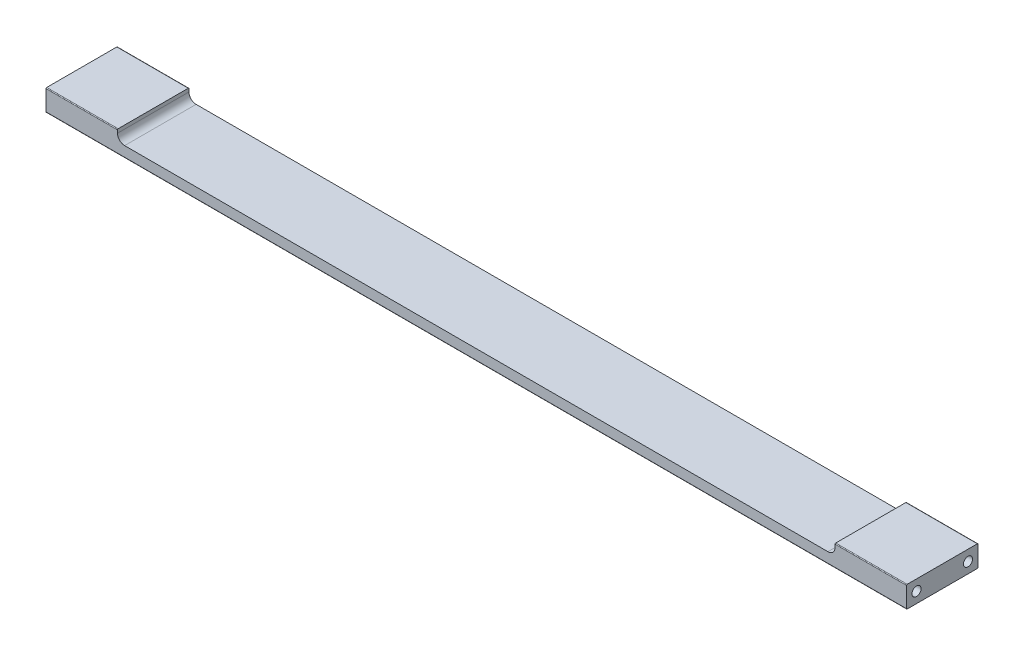
ISO-10303-21;
HEADER;
FILE_DESCRIPTION(('STEP AP214'),'2;1');
FILE_NAME('part.step','',(''),(''),'','','');
FILE_SCHEMA(('AUTOMOTIVE_DESIGN { 1 0 10303 214 1 1 1 1 }'));
ENDSEC;
DATA;
#1=APPLICATION_CONTEXT('core data for automotive mechanical design processes');
#2=APPLICATION_PROTOCOL_DEFINITION('international standard','automotive_design',2000,#1);
#3=PRODUCT_CONTEXT('',#1,'mechanical');
#4=PRODUCT('Part','Part','',(#3));
#5=PRODUCT_RELATED_PRODUCT_CATEGORY('part','',(#4));
#6=PRODUCT_DEFINITION_FORMATION('','',#4);
#7=PRODUCT_DEFINITION_CONTEXT('part definition',#1,'design');
#8=PRODUCT_DEFINITION('design','',#6,#7);
#9=PRODUCT_DEFINITION_SHAPE('','',#8);
#10=(LENGTH_UNIT() NAMED_UNIT(*) SI_UNIT(.MILLI.,.METRE.));
#11=(NAMED_UNIT(*) PLANE_ANGLE_UNIT() SI_UNIT($,.RADIAN.));
#12=(NAMED_UNIT(*) SI_UNIT($,.STERADIAN.) SOLID_ANGLE_UNIT());
#13=UNCERTAINTY_MEASURE_WITH_UNIT(LENGTH_MEASURE(1.E-05),#10,'distance_accuracy_value','');
#14=(GEOMETRIC_REPRESENTATION_CONTEXT(3) GLOBAL_UNCERTAINTY_ASSIGNED_CONTEXT((#13)) GLOBAL_UNIT_ASSIGNED_CONTEXT((#10,
#11,#12)) REPRESENTATION_CONTEXT('',''));
#15=CARTESIAN_POINT('',(0.,0.,0.));
#16=DIRECTION('',(0.,0.,1.));
#17=DIRECTION('',(1.,0.,0.));
#18=AXIS2_PLACEMENT_3D('',#15,#16,#17);
#19=CARTESIAN_POINT('',(0.,4.7625,0.));
#20=DIRECTION('',(0.,1.,0.));
#21=DIRECTION('',(0.,0.,1.));
#22=AXIS2_PLACEMENT_3D('',#19,#20,#21);
#23=PLANE('',#22);
#24=DIRECTION('',(0.,0.,-1.));
#25=VECTOR('',#24,1.);
#26=CARTESIAN_POINT('',(-159.385,4.76249999999999,15.875));
#27=LINE('',#26,#25);
#28=CARTESIAN_POINT('',(-159.385,4.76249999999999,15.560675));
#29=VERTEX_POINT('',#28);
#30=CARTESIAN_POINT('',(-159.385,4.76249999999999,-15.560675));
#31=VERTEX_POINT('',#30);
#32=EDGE_CURVE('E223',#29,#31,#27,.T.);
#33=ORIENTED_EDGE('',*,*,#32,.T.);
#34=DIRECTION('',(-1.,0.,0.));
#35=VECTOR('',#34,1.);
#36=CARTESIAN_POINT('',(0.,4.7625,-15.560675));
#37=LINE('',#36,#35);
#38=CARTESIAN_POINT('',(-191.135,4.7625,-15.560675));
#39=VERTEX_POINT('',#38);
#40=EDGE_CURVE('E355',#31,#39,#37,.T.);
#41=ORIENTED_EDGE('',*,*,#40,.T.);
#42=DIRECTION('',(0.,0.,1.));
#43=VECTOR('',#42,1.);
#44=CARTESIAN_POINT('',(-191.135,4.7625,-15.875));
#45=LINE('',#44,#43);
#46=CARTESIAN_POINT('',(-191.135,4.7625,15.560675));
#47=VERTEX_POINT('',#46);
#48=EDGE_CURVE('E275',#39,#47,#45,.T.);
#49=ORIENTED_EDGE('',*,*,#48,.T.);
#50=DIRECTION('',(1.,0.,0.));
#51=VECTOR('',#50,1.);
#52=CARTESIAN_POINT('',(0.,4.7625,15.560675));
#53=LINE('',#52,#51);
#54=EDGE_CURVE('E351',#47,#29,#53,.T.);
#55=ORIENTED_EDGE('',*,*,#54,.T.);
#56=EDGE_LOOP('',(#33,#41,#49,#55));
#57=FACE_BOUND('',#56,.T.);
#58=ADVANCED_FACE('F43',(#57),#23,.T.);
#59=CARTESIAN_POINT('',(0.,4.448175,-15.560675));
#60=DIRECTION('',(-1.,0.,0.));
#61=DIRECTION('',(0.,0.,1.));
#62=AXIS2_PLACEMENT_3D('',#59,#60,#61);
#63=CYLINDRICAL_SURFACE('',#62,0.314325);
#64=CARTESIAN_POINT('',(-159.385,4.448175,-15.560675));
#65=DIRECTION('',(-1.,0.,0.));
#66=DIRECTION('',(0.,0.,1.));
#67=AXIS2_PLACEMENT_3D('',#64,#65,#66);
#68=CIRCLE('',#67,0.314325);
#69=CARTESIAN_POINT('',(-159.385,4.448175,-15.875));
#70=VERTEX_POINT('',#69);
#71=EDGE_CURVE('E240',#70,#31,#68,.F.);
#72=ORIENTED_EDGE('',*,*,#71,.F.);
#73=DIRECTION('',(-1.,0.,0.));
#74=VECTOR('',#73,1.);
#75=CARTESIAN_POINT('',(-191.135,4.448175,-15.875));
#76=LINE('',#75,#74);
#77=CARTESIAN_POINT('',(-191.135,4.448175,-15.875));
#78=VERTEX_POINT('',#77);
#79=EDGE_CURVE('E342',#78,#70,#76,.F.);
#80=ORIENTED_EDGE('',*,*,#79,.F.);
#81=CARTESIAN_POINT('',(-191.135,4.448175,-15.560675));
#82=DIRECTION('',(-1.,0.,0.));
#83=DIRECTION('',(0.,0.,1.));
#84=AXIS2_PLACEMENT_3D('',#81,#82,#83);
#85=CIRCLE('',#84,0.314325);
#86=EDGE_CURVE('E67',#39,#78,#85,.T.);
#87=ORIENTED_EDGE('',*,*,#86,.F.);
#88=ORIENTED_EDGE('',*,*,#40,.F.);
#89=EDGE_LOOP('',(#72,#80,#87,#88));
#90=FACE_BOUND('',#89,.T.);
#91=ADVANCED_FACE('F389',(#90),#63,.T.);
#92=CARTESIAN_POINT('',(0.,4.448175,15.560675));
#93=DIRECTION('',(1.,0.,0.));
#94=DIRECTION('',(0.,0.,-1.));
#95=AXIS2_PLACEMENT_3D('',#92,#93,#94);
#96=CYLINDRICAL_SURFACE('',#95,0.314325);
#97=CARTESIAN_POINT('',(-159.385,4.448175,15.560675));
#98=DIRECTION('',(-1.,0.,0.));
#99=DIRECTION('',(0.,0.,1.));
#100=AXIS2_PLACEMENT_3D('',#97,#98,#99);
#101=CIRCLE('',#100,0.314325);
#102=CARTESIAN_POINT('',(-159.385,4.448175,15.875));
#103=VERTEX_POINT('',#102);
#104=EDGE_CURVE('E11',#29,#103,#101,.F.);
#105=ORIENTED_EDGE('',*,*,#104,.F.);
#106=ORIENTED_EDGE('',*,*,#54,.F.);
#107=CARTESIAN_POINT('',(-191.135,4.448175,15.560675));
#108=DIRECTION('',(-1.,0.,0.));
#109=DIRECTION('',(0.,0.,1.));
#110=AXIS2_PLACEMENT_3D('',#107,#108,#109);
#111=CIRCLE('',#110,0.314325);
#112=CARTESIAN_POINT('',(-191.135,4.448175,15.875));
#113=VERTEX_POINT('',#112);
#114=EDGE_CURVE('E330',#113,#47,#111,.T.);
#115=ORIENTED_EDGE('',*,*,#114,.F.);
#116=DIRECTION('',(1.,0.,0.));
#117=VECTOR('',#116,1.);
#118=CARTESIAN_POINT('',(-191.135,4.448175,15.875));
#119=LINE('',#118,#117);
#120=EDGE_CURVE('E295',#103,#113,#119,.F.);
#121=ORIENTED_EDGE('',*,*,#120,.F.);
#122=EDGE_LOOP('',(#105,#106,#115,#121));
#123=FACE_BOUND('',#122,.T.);
#124=ADVANCED_FACE('F383',(#123),#96,.T.);
#125=CARTESIAN_POINT('',(-191.135,-4.7625,-15.875));
#126=DIRECTION('',(-1.,0.,0.));
#127=DIRECTION('',(0.,0.,1.));
#128=AXIS2_PLACEMENT_3D('',#125,#126,#127);
#129=PLANE('',#128);
#130=CARTESIAN_POINT('',(-191.135,0.,-11.43));
#131=DIRECTION('',(-1.,0.,0.));
#132=DIRECTION('',(0.,0.,1.));
#133=AXIS2_PLACEMENT_3D('',#130,#131,#132);
#134=CIRCLE('',#133,2.01929999999999);
#135=CARTESIAN_POINT('',(-191.135,0.,-9.41070000000001));
#136=VERTEX_POINT('',#135);
#137=EDGE_CURVE('E259',#136,#136,#134,.T.);
#138=ORIENTED_EDGE('',*,*,#137,.F.);
#139=EDGE_LOOP('',(#138));
#140=FACE_BOUND('',#139,.T.);
#141=CARTESIAN_POINT('',(-191.135,0.,11.43));
#142=DIRECTION('',(-1.,0.,0.));
#143=DIRECTION('',(0.,0.,1.));
#144=AXIS2_PLACEMENT_3D('',#141,#142,#143);
#145=CIRCLE('',#144,2.01929999999999);
#146=CARTESIAN_POINT('',(-191.135,0.,13.4493));
#147=VERTEX_POINT('',#146);
#148=EDGE_CURVE('E267',#147,#147,#145,.T.);
#149=ORIENTED_EDGE('',*,*,#148,.F.);
#150=EDGE_LOOP('',(#149));
#151=FACE_BOUND('',#150,.T.);
#152=DIRECTION('',(0.,0.,1.));
#153=VECTOR('',#152,1.);
#154=CARTESIAN_POINT('',(-191.135,-4.7625,-15.875));
#155=LINE('',#154,#153);
#156=CARTESIAN_POINT('',(-191.135,-4.7625,-15.560675));
#157=VERTEX_POINT('',#156);
#158=CARTESIAN_POINT('',(-191.135,-4.7625,15.560675));
#159=VERTEX_POINT('',#158);
#160=EDGE_CURVE('E283',#157,#159,#155,.T.);
#161=ORIENTED_EDGE('',*,*,#160,.T.);
#162=CARTESIAN_POINT('',(-191.135,-4.448175,15.560675));
#163=DIRECTION('',(-1.,0.,0.));
#164=DIRECTION('',(0.,0.,1.));
#165=AXIS2_PLACEMENT_3D('',#162,#163,#164);
#166=CIRCLE('',#165,0.314325);
#167=CARTESIAN_POINT('',(-191.135,-4.448175,15.875));
#168=VERTEX_POINT('',#167);
#169=EDGE_CURVE('E338',#159,#168,#166,.T.);
#170=ORIENTED_EDGE('',*,*,#169,.T.);
#171=DIRECTION('',(0.,1.,0.));
#172=VECTOR('',#171,1.);
#173=CARTESIAN_POINT('',(-191.135,-4.7625,15.875));
#174=LINE('',#173,#172);
#175=EDGE_CURVE('E291',#168,#113,#174,.T.);
#176=ORIENTED_EDGE('',*,*,#175,.T.);
#177=ORIENTED_EDGE('',*,*,#114,.T.);
#178=ORIENTED_EDGE('',*,*,#48,.F.);
#179=ORIENTED_EDGE('',*,*,#86,.T.);
#180=DIRECTION('',(0.,1.,0.));
#181=VECTOR('',#180,1.);
#182=CARTESIAN_POINT('',(-191.135,-4.7625,-15.875));
#183=LINE('',#182,#181);
#184=CARTESIAN_POINT('',(-191.135,-4.448175,-15.875));
#185=VERTEX_POINT('',#184);
#186=EDGE_CURVE('E292',#185,#78,#183,.T.);
#187=ORIENTED_EDGE('',*,*,#186,.F.);
#188=CARTESIAN_POINT('',(-191.135,-4.448175,-15.560675));
#189=DIRECTION('',(-1.,0.,0.));
#190=DIRECTION('',(0.,0.,1.));
#191=AXIS2_PLACEMENT_3D('',#188,#189,#190);
#192=CIRCLE('',#191,0.314325);
#193=EDGE_CURVE('E335',#185,#157,#192,.T.);
#194=ORIENTED_EDGE('',*,*,#193,.T.);
#195=EDGE_LOOP('',(#161,#170,#176,#177,#178,#179,#187,#194));
#196=FACE_BOUND('',#195,.T.);
#197=ADVANCED_FACE('F380',(#140,#151,#196),#129,.T.);
#198=CARTESIAN_POINT('',(-191.135,-4.7625,-15.875));
#199=DIRECTION('',(0.,0.,-1.));
#200=DIRECTION('',(-1.,0.,0.));
#201=AXIS2_PLACEMENT_3D('',#198,#199,#200);
#202=PLANE('',#201);
#203=DIRECTION('',(0.,1.,0.));
#204=VECTOR('',#203,1.);
#205=CARTESIAN_POINT('',(-159.385,4.76249999999999,-15.875));
#206=LINE('',#205,#204);
#207=CARTESIAN_POINT('',(-159.385,3.17500000000004,-15.875));
#208=VERTEX_POINT('',#207);
#209=EDGE_CURVE('E196',#208,#70,#206,.T.);
#210=ORIENTED_EDGE('',*,*,#209,.F.);
#211=CARTESIAN_POINT('',(-156.21,3.175,-15.875));
#212=DIRECTION('',(0.,0.,-1.));
#213=DIRECTION('',(1.,0.,0.));
#214=AXIS2_PLACEMENT_3D('',#211,#212,#213);
#215=CIRCLE('',#214,3.17499999999999);
#216=CARTESIAN_POINT('',(-156.21,0.,-15.875));
#217=VERTEX_POINT('',#216);
#218=EDGE_CURVE('E199',#217,#208,#215,.T.);
#219=ORIENTED_EDGE('',*,*,#218,.F.);
#220=DIRECTION('',(-1.,0.,0.));
#221=VECTOR('',#220,1.);
#222=CARTESIAN_POINT('',(-156.21,0.,-15.875));
#223=LINE('',#222,#221);
#224=CARTESIAN_POINT('',(156.21,0.,-15.875));
#225=VERTEX_POINT('',#224);
#226=EDGE_CURVE('E216',#225,#217,#223,.T.);
#227=ORIENTED_EDGE('',*,*,#226,.F.);
#228=CARTESIAN_POINT('',(156.21,3.17499999999996,-15.875));
#229=DIRECTION('',(0.,0.,-1.));
#230=DIRECTION('',(1.,0.,0.));
#231=AXIS2_PLACEMENT_3D('',#228,#229,#230);
#232=CIRCLE('',#231,3.17500000000001);
#233=CARTESIAN_POINT('',(159.385,3.17499999999996,-15.875));
#234=VERTEX_POINT('',#233);
#235=EDGE_CURVE('E213',#234,#225,#232,.T.);
#236=ORIENTED_EDGE('',*,*,#235,.F.);
#237=DIRECTION('',(0.,-1.,0.));
#238=VECTOR('',#237,1.);
#239=CARTESIAN_POINT('',(159.385,3.17499999999998,-15.875));
#240=LINE('',#239,#238);
#241=CARTESIAN_POINT('',(159.385,4.448175,-15.875));
#242=VERTEX_POINT('',#241);
#243=EDGE_CURVE('E172',#242,#234,#240,.T.);
#244=ORIENTED_EDGE('',*,*,#243,.F.);
#245=CARTESIAN_POINT('',(191.135,4.448175,-15.875));
#246=VERTEX_POINT('',#245);
#247=EDGE_CURVE('E341',#242,#246,#76,.F.);
#248=ORIENTED_EDGE('',*,*,#247,.T.);
#249=DIRECTION('',(0.,1.,0.));
#250=VECTOR('',#249,1.);
#251=CARTESIAN_POINT('',(191.135,-4.7625,-15.875));
#252=LINE('',#251,#250);
#253=CARTESIAN_POINT('',(191.135,-4.448175,-15.875));
#254=VERTEX_POINT('',#253);
#255=EDGE_CURVE('E296',#254,#246,#252,.T.);
#256=ORIENTED_EDGE('',*,*,#255,.F.);
#257=DIRECTION('',(-1.,0.,0.));
#258=VECTOR('',#257,1.);
#259=CARTESIAN_POINT('',(-191.135,-4.448175,-15.875));
#260=LINE('',#259,#258);
#261=EDGE_CURVE('E346',#254,#185,#260,.T.);
#262=ORIENTED_EDGE('',*,*,#261,.T.);
#263=ORIENTED_EDGE('',*,*,#186,.T.);
#264=ORIENTED_EDGE('',*,*,#79,.T.);
#265=EDGE_LOOP('',(#210,#219,#227,#236,#244,#248,#256,#262,#263,#264));
#266=FACE_BOUND('',#265,.T.);
#267=ADVANCED_FACE('F392',(#266),#202,.T.);
#268=CARTESIAN_POINT('',(191.135,-4.7625,-15.875));
#269=DIRECTION('',(1.,0.,0.));
#270=DIRECTION('',(0.,0.,-1.));
#271=AXIS2_PLACEMENT_3D('',#268,#269,#270);
#272=PLANE('',#271);
#273=CARTESIAN_POINT('',(191.135,0.,11.43));
#274=DIRECTION('',(1.,0.,0.));
#275=DIRECTION('',(0.,0.,-1.));
#276=AXIS2_PLACEMENT_3D('',#273,#274,#275);
#277=CIRCLE('',#276,2.01929999999999);
#278=CARTESIAN_POINT('',(191.135,0.,9.41070000000001));
#279=VERTEX_POINT('',#278);
#280=EDGE_CURVE('E243',#279,#279,#277,.T.);
#281=ORIENTED_EDGE('',*,*,#280,.F.);
#282=EDGE_LOOP('',(#281));
#283=FACE_BOUND('',#282,.T.);
#284=CARTESIAN_POINT('',(191.135,0.,-11.43));
#285=DIRECTION('',(1.,0.,0.));
#286=DIRECTION('',(0.,0.,-1.));
#287=AXIS2_PLACEMENT_3D('',#284,#285,#286);
#288=CIRCLE('',#287,2.01929999999999);
#289=CARTESIAN_POINT('',(191.135,0.,-13.4493));
#290=VERTEX_POINT('',#289);
#291=EDGE_CURVE('E251',#290,#290,#288,.T.);
#292=ORIENTED_EDGE('',*,*,#291,.F.);
#293=EDGE_LOOP('',(#292));
#294=FACE_BOUND('',#293,.T.);
#295=DIRECTION('',(0.,1.,0.));
#296=VECTOR('',#295,1.);
#297=CARTESIAN_POINT('',(191.135,-4.7625,15.875));
#298=LINE('',#297,#296);
#299=CARTESIAN_POINT('',(191.135,-4.448175,15.875));
#300=VERTEX_POINT('',#299);
#301=CARTESIAN_POINT('',(191.135,4.448175,15.875));
#302=VERTEX_POINT('',#301);
#303=EDGE_CURVE('E300',#300,#302,#298,.T.);
#304=ORIENTED_EDGE('',*,*,#303,.F.);
#305=CARTESIAN_POINT('',(191.135,-4.448175,15.560675));
#306=DIRECTION('',(1.,0.,0.));
#307=DIRECTION('',(0.,0.,-1.));
#308=AXIS2_PLACEMENT_3D('',#305,#306,#307);
#309=CIRCLE('',#308,0.314325);
#310=CARTESIAN_POINT('',(191.135,-4.7625,15.560675));
#311=VERTEX_POINT('',#310);
#312=EDGE_CURVE('E321',#300,#311,#309,.T.);
#313=ORIENTED_EDGE('',*,*,#312,.T.);
#314=DIRECTION('',(0.,0.,-1.));
#315=VECTOR('',#314,1.);
#316=CARTESIAN_POINT('',(191.135,-4.7625,-15.875));
#317=LINE('',#316,#315);
#318=CARTESIAN_POINT('',(191.135,-4.7625,-15.560675));
#319=VERTEX_POINT('',#318);
#320=EDGE_CURVE('E287',#311,#319,#317,.T.);
#321=ORIENTED_EDGE('',*,*,#320,.T.);
#322=CARTESIAN_POINT('',(191.135,-4.448175,-15.560675));
#323=DIRECTION('',(1.,0.,0.));
#324=DIRECTION('',(0.,0.,-1.));
#325=AXIS2_PLACEMENT_3D('',#322,#323,#324);
#326=CIRCLE('',#325,0.314325);
#327=EDGE_CURVE('E318',#319,#254,#326,.T.);
#328=ORIENTED_EDGE('',*,*,#327,.T.);
#329=ORIENTED_EDGE('',*,*,#255,.T.);
#330=CARTESIAN_POINT('',(191.135,4.448175,-15.560675));
#331=DIRECTION('',(1.,0.,0.));
#332=DIRECTION('',(0.,0.,-1.));
#333=AXIS2_PLACEMENT_3D('',#330,#331,#332);
#334=CIRCLE('',#333,0.314325);
#335=CARTESIAN_POINT('',(191.135,4.7625,-15.560675));
#336=VERTEX_POINT('',#335);
#337=EDGE_CURVE('E315',#246,#336,#334,.T.);
#338=ORIENTED_EDGE('',*,*,#337,.T.);
#339=DIRECTION('',(0.,0.,-1.));
#340=VECTOR('',#339,1.);
#341=CARTESIAN_POINT('',(191.135,4.7625,-15.875));
#342=LINE('',#341,#340);
#343=CARTESIAN_POINT('',(191.135,4.7625,15.560675));
#344=VERTEX_POINT('',#343);
#345=EDGE_CURVE('E279',#344,#336,#342,.T.);
#346=ORIENTED_EDGE('',*,*,#345,.F.);
#347=CARTESIAN_POINT('',(191.135,4.448175,15.560675));
#348=DIRECTION('',(1.,0.,0.));
#349=DIRECTION('',(0.,0.,-1.));
#350=AXIS2_PLACEMENT_3D('',#347,#348,#349);
#351=CIRCLE('',#350,0.314325);
#352=EDGE_CURVE('E312',#344,#302,#351,.T.);
#353=ORIENTED_EDGE('',*,*,#352,.T.);
#354=EDGE_LOOP('',(#304,#313,#321,#328,#329,#338,#346,#353));
#355=FACE_BOUND('',#354,.T.);
#356=ADVANCED_FACE('F407',(#283,#294,#355),#272,.T.);
#357=CARTESIAN_POINT('',(-191.135,-4.7625,15.875));
#358=DIRECTION('',(0.,0.,1.));
#359=DIRECTION('',(1.,0.,0.));
#360=AXIS2_PLACEMENT_3D('',#357,#358,#359);
#361=PLANE('',#360);
#362=DIRECTION('',(0.,1.,0.));
#363=VECTOR('',#362,1.);
#364=CARTESIAN_POINT('',(-159.385,4.76249999999999,15.875));
#365=LINE('',#364,#363);
#366=CARTESIAN_POINT('',(-159.385,3.17500000000004,15.875));
#367=VERTEX_POINT('',#366);
#368=EDGE_CURVE('E208',#367,#103,#365,.T.);
#369=ORIENTED_EDGE('',*,*,#368,.T.);
#370=ORIENTED_EDGE('',*,*,#120,.T.);
#371=ORIENTED_EDGE('',*,*,#175,.F.);
#372=DIRECTION('',(1.,0.,0.));
#373=VECTOR('',#372,1.);
#374=CARTESIAN_POINT('',(191.135,-4.448175,15.875));
#375=LINE('',#374,#373);
#376=EDGE_CURVE('E308',#168,#300,#375,.T.);
#377=ORIENTED_EDGE('',*,*,#376,.T.);
#378=ORIENTED_EDGE('',*,*,#303,.T.);
#379=CARTESIAN_POINT('',(159.385,4.448175,15.875));
#380=VERTEX_POINT('',#379);
#381=EDGE_CURVE('E194',#302,#380,#119,.F.);
#382=ORIENTED_EDGE('',*,*,#381,.T.);
#383=DIRECTION('',(0.,-1.,0.));
#384=VECTOR('',#383,1.);
#385=CARTESIAN_POINT('',(159.385,3.17499999999998,15.875));
#386=LINE('',#385,#384);
#387=CARTESIAN_POINT('',(159.385,3.17499999999996,15.875));
#388=VERTEX_POINT('',#387);
#389=EDGE_CURVE('E59',#380,#388,#386,.T.);
#390=ORIENTED_EDGE('',*,*,#389,.T.);
#391=CARTESIAN_POINT('',(156.21,3.17499999999996,15.875));
#392=DIRECTION('',(0.,0.,-1.));
#393=DIRECTION('',(1.,0.,0.));
#394=AXIS2_PLACEMENT_3D('',#391,#392,#393);
#395=CIRCLE('',#394,3.17500000000001);
#396=CARTESIAN_POINT('',(156.21,0.,15.875));
#397=VERTEX_POINT('',#396);
#398=EDGE_CURVE('E181',#388,#397,#395,.T.);
#399=ORIENTED_EDGE('',*,*,#398,.T.);
#400=DIRECTION('',(-1.,0.,0.));
#401=VECTOR('',#400,1.);
#402=CARTESIAN_POINT('',(-156.21,0.,15.875));
#403=LINE('',#402,#401);
#404=CARTESIAN_POINT('',(-156.21,0.,15.875));
#405=VERTEX_POINT('',#404);
#406=EDGE_CURVE('E187',#397,#405,#403,.T.);
#407=ORIENTED_EDGE('',*,*,#406,.T.);
#408=CARTESIAN_POINT('',(-156.21,3.175,15.875));
#409=DIRECTION('',(0.,0.,-1.));
#410=DIRECTION('',(1.,0.,0.));
#411=AXIS2_PLACEMENT_3D('',#408,#409,#410);
#412=CIRCLE('',#411,3.17499999999999);
#413=EDGE_CURVE('E204',#405,#367,#412,.T.);
#414=ORIENTED_EDGE('',*,*,#413,.T.);
#415=EDGE_LOOP('',(#369,#370,#371,#377,#378,#382,#390,#399,#407,#414));
#416=FACE_BOUND('',#415,.T.);
#417=ADVANCED_FACE('F191',(#416),#361,.T.);
#418=CARTESIAN_POINT('',(0.,-4.7625,0.));
#419=DIRECTION('',(0.,1.,0.));
#420=DIRECTION('',(0.,0.,1.));
#421=AXIS2_PLACEMENT_3D('',#418,#419,#420);
#422=PLANE('',#421);
#423=ORIENTED_EDGE('',*,*,#320,.F.);
#424=DIRECTION('',(1.,0.,0.));
#425=VECTOR('',#424,1.);
#426=CARTESIAN_POINT('',(-191.135,-4.7625,15.560675));
#427=LINE('',#426,#425);
#428=EDGE_CURVE('E327',#311,#159,#427,.F.);
#429=ORIENTED_EDGE('',*,*,#428,.T.);
#430=ORIENTED_EDGE('',*,*,#160,.F.);
#431=DIRECTION('',(-1.,0.,0.));
#432=VECTOR('',#431,1.);
#433=CARTESIAN_POINT('',(191.135,-4.7625,-15.560675));
#434=LINE('',#433,#432);
#435=EDGE_CURVE('E324',#157,#319,#434,.F.);
#436=ORIENTED_EDGE('',*,*,#435,.T.);
#437=EDGE_LOOP('',(#423,#429,#430,#436));
#438=FACE_BOUND('',#437,.T.);
#439=ADVANCED_FACE('F401',(#438),#422,.F.);
#440=DIRECTION('',(0.,0.,-1.));
#441=VECTOR('',#440,1.);
#442=CARTESIAN_POINT('',(159.385,4.76249999999999,15.875));
#443=LINE('',#442,#441);
#444=CARTESIAN_POINT('',(159.385,4.76249999999999,15.560675));
#445=VERTEX_POINT('',#444);
#446=CARTESIAN_POINT('',(159.385,4.76249999999999,-15.560675));
#447=VERTEX_POINT('',#446);
#448=EDGE_CURVE('E178',#445,#447,#443,.T.);
#449=ORIENTED_EDGE('',*,*,#448,.F.);
#450=EDGE_CURVE('E350',#445,#344,#53,.T.);
#451=ORIENTED_EDGE('',*,*,#450,.T.);
#452=ORIENTED_EDGE('',*,*,#345,.T.);
#453=EDGE_CURVE('E356',#336,#447,#37,.T.);
#454=ORIENTED_EDGE('',*,*,#453,.T.);
#455=EDGE_LOOP('',(#449,#451,#452,#454));
#456=FACE_BOUND('',#455,.T.);
#457=ADVANCED_FACE('F365',(#456),#23,.T.);
#458=CARTESIAN_POINT('',(-191.135,-4.448175,15.560675));
#459=DIRECTION('',(-1.,0.,0.));
#460=DIRECTION('',(0.,0.,1.));
#461=AXIS2_PLACEMENT_3D('',#458,#459,#460);
#462=CYLINDRICAL_SURFACE('',#461,0.314325);
#463=ORIENTED_EDGE('',*,*,#169,.F.);
#464=ORIENTED_EDGE('',*,*,#428,.F.);
#465=ORIENTED_EDGE('',*,*,#312,.F.);
#466=ORIENTED_EDGE('',*,*,#376,.F.);
#467=EDGE_LOOP('',(#463,#464,#465,#466));
#468=FACE_BOUND('',#467,.T.);
#469=ADVANCED_FACE('F413',(#468),#462,.T.);
#470=CARTESIAN_POINT('',(-191.135,-4.448175,-15.560675));
#471=DIRECTION('',(1.,0.,0.));
#472=DIRECTION('',(0.,0.,-1.));
#473=AXIS2_PLACEMENT_3D('',#470,#471,#472);
#474=CYLINDRICAL_SURFACE('',#473,0.314325);
#475=ORIENTED_EDGE('',*,*,#327,.F.);
#476=ORIENTED_EDGE('',*,*,#435,.F.);
#477=ORIENTED_EDGE('',*,*,#193,.F.);
#478=ORIENTED_EDGE('',*,*,#261,.F.);
#479=EDGE_LOOP('',(#475,#476,#477,#478));
#480=FACE_BOUND('',#479,.T.);
#481=ADVANCED_FACE('F404',(#480),#474,.T.);
#482=CARTESIAN_POINT('',(159.385,4.448175,-15.560675));
#483=DIRECTION('',(1.,0.,0.));
#484=DIRECTION('',(0.,0.,-1.));
#485=AXIS2_PLACEMENT_3D('',#482,#483,#484);
#486=CIRCLE('',#485,0.314325);
#487=EDGE_CURVE('E227',#447,#242,#486,.F.);
#488=ORIENTED_EDGE('',*,*,#487,.F.);
#489=ORIENTED_EDGE('',*,*,#453,.F.);
#490=ORIENTED_EDGE('',*,*,#337,.F.);
#491=ORIENTED_EDGE('',*,*,#247,.F.);
#492=EDGE_LOOP('',(#488,#489,#490,#491));
#493=FACE_BOUND('',#492,.T.);
#494=ADVANCED_FACE('F411',(#493),#63,.T.);
#495=CARTESIAN_POINT('',(159.385,4.448175,15.560675));
#496=DIRECTION('',(1.,0.,0.));
#497=DIRECTION('',(0.,0.,-1.));
#498=AXIS2_PLACEMENT_3D('',#495,#496,#497);
#499=CIRCLE('',#498,0.314325);
#500=EDGE_CURVE('E52',#380,#445,#499,.F.);
#501=ORIENTED_EDGE('',*,*,#500,.F.);
#502=ORIENTED_EDGE('',*,*,#381,.F.);
#503=ORIENTED_EDGE('',*,*,#352,.F.);
#504=ORIENTED_EDGE('',*,*,#450,.F.);
#505=EDGE_LOOP('',(#501,#502,#503,#504));
#506=FACE_BOUND('',#505,.T.);
#507=ADVANCED_FACE('F45',(#506),#96,.T.);
#508=CARTESIAN_POINT('',(-165.735,0.,11.43));
#509=DIRECTION('',(-1.,0.,0.));
#510=DIRECTION('',(0.,0.,1.));
#511=AXIS2_PLACEMENT_3D('',#508,#509,#510);
#512=CONICAL_SURFACE('',#511,2.01929999999999,1.02974425867665);
#513=CARTESIAN_POINT('',(-164.521682151998,0.,11.43));
#514=VERTEX_POINT('',#513);
#515=VERTEX_LOOP('',#514);
#516=FACE_BOUND('',#515,.T.);
#517=CARTESIAN_POINT('',(-165.735,0.,11.43));
#518=DIRECTION('',(-1.,0.,0.));
#519=DIRECTION('',(0.,0.,1.));
#520=AXIS2_PLACEMENT_3D('',#517,#518,#519);
#521=CIRCLE('',#520,2.01929999999999);
#522=CARTESIAN_POINT('',(-165.735,0.,13.4493));
#523=VERTEX_POINT('',#522);
#524=EDGE_CURVE('E271',#523,#523,#521,.T.);
#525=ORIENTED_EDGE('',*,*,#524,.T.);
#526=EDGE_LOOP('',(#525));
#527=FACE_BOUND('',#526,.T.);
#528=ADVANCED_FACE('F429',(#516,#527),#512,.F.);
#529=CARTESIAN_POINT('',(-191.135,0.,11.43));
#530=DIRECTION('',(-1.,0.,0.));
#531=DIRECTION('',(0.,0.,1.));
#532=AXIS2_PLACEMENT_3D('',#529,#530,#531);
#533=CYLINDRICAL_SURFACE('',#532,2.01929999999999);
#534=ORIENTED_EDGE('',*,*,#524,.F.);
#535=EDGE_LOOP('',(#534));
#536=FACE_BOUND('',#535,.T.);
#537=ORIENTED_EDGE('',*,*,#148,.T.);
#538=EDGE_LOOP('',(#537));
#539=FACE_BOUND('',#538,.T.);
#540=ADVANCED_FACE('F448',(#536,#539),#533,.F.);
#541=CARTESIAN_POINT('',(-165.735,0.,-11.43));
#542=DIRECTION('',(-1.,0.,0.));
#543=DIRECTION('',(0.,0.,1.));
#544=AXIS2_PLACEMENT_3D('',#541,#542,#543);
#545=CONICAL_SURFACE('',#544,2.01929999999999,1.02974425867665);
#546=CARTESIAN_POINT('',(-164.521682151998,0.,-11.43));
#547=VERTEX_POINT('',#546);
#548=VERTEX_LOOP('',#547);
#549=FACE_BOUND('',#548,.T.);
#550=CARTESIAN_POINT('',(-165.735,0.,-11.43));
#551=DIRECTION('',(-1.,0.,0.));
#552=DIRECTION('',(0.,0.,1.));
#553=AXIS2_PLACEMENT_3D('',#550,#551,#552);
#554=CIRCLE('',#553,2.01929999999999);
#555=CARTESIAN_POINT('',(-165.735,0.,-9.41070000000001));
#556=VERTEX_POINT('',#555);
#557=EDGE_CURVE('E263',#556,#556,#554,.T.);
#558=ORIENTED_EDGE('',*,*,#557,.T.);
#559=EDGE_LOOP('',(#558));
#560=FACE_BOUND('',#559,.T.);
#561=ADVANCED_FACE('F450',(#549,#560),#545,.F.);
#562=CARTESIAN_POINT('',(-191.135,0.,-11.43));
#563=DIRECTION('',(-1.,0.,0.));
#564=DIRECTION('',(0.,0.,1.));
#565=AXIS2_PLACEMENT_3D('',#562,#563,#564);
#566=CYLINDRICAL_SURFACE('',#565,2.01929999999999);
#567=ORIENTED_EDGE('',*,*,#557,.F.);
#568=EDGE_LOOP('',(#567));
#569=FACE_BOUND('',#568,.T.);
#570=ORIENTED_EDGE('',*,*,#137,.T.);
#571=EDGE_LOOP('',(#570));
#572=FACE_BOUND('',#571,.T.);
#573=ADVANCED_FACE('F456',(#569,#572),#566,.F.);
#574=CARTESIAN_POINT('',(165.735,0.,-11.43));
#575=DIRECTION('',(1.,0.,0.));
#576=DIRECTION('',(0.,0.,-1.));
#577=AXIS2_PLACEMENT_3D('',#574,#575,#576);
#578=CONICAL_SURFACE('',#577,2.01929999999999,1.02974425867665);
#579=CARTESIAN_POINT('',(164.521682151998,0.,-11.43));
#580=VERTEX_POINT('',#579);
#581=VERTEX_LOOP('',#580);
#582=FACE_BOUND('',#581,.T.);
#583=CARTESIAN_POINT('',(165.735,0.,-11.43));
#584=DIRECTION('',(1.,0.,0.));
#585=DIRECTION('',(0.,0.,-1.));
#586=AXIS2_PLACEMENT_3D('',#583,#584,#585);
#587=CIRCLE('',#586,2.01929999999999);
#588=CARTESIAN_POINT('',(165.735,0.,-13.4493));
#589=VERTEX_POINT('',#588);
#590=EDGE_CURVE('E255',#589,#589,#587,.T.);
#591=ORIENTED_EDGE('',*,*,#590,.T.);
#592=EDGE_LOOP('',(#591));
#593=FACE_BOUND('',#592,.T.);
#594=ADVANCED_FACE('F464',(#582,#593),#578,.F.);
#595=CARTESIAN_POINT('',(191.135,0.,-11.43));
#596=DIRECTION('',(1.,0.,0.));
#597=DIRECTION('',(0.,0.,-1.));
#598=AXIS2_PLACEMENT_3D('',#595,#596,#597);
#599=CYLINDRICAL_SURFACE('',#598,2.01929999999999);
#600=ORIENTED_EDGE('',*,*,#590,.F.);
#601=EDGE_LOOP('',(#600));
#602=FACE_BOUND('',#601,.T.);
#603=ORIENTED_EDGE('',*,*,#291,.T.);
#604=EDGE_LOOP('',(#603));
#605=FACE_BOUND('',#604,.T.);
#606=ADVANCED_FACE('F468',(#602,#605),#599,.F.);
#607=CARTESIAN_POINT('',(165.735,0.,11.43));
#608=DIRECTION('',(1.,0.,0.));
#609=DIRECTION('',(0.,0.,-1.));
#610=AXIS2_PLACEMENT_3D('',#607,#608,#609);
#611=CONICAL_SURFACE('',#610,2.01929999999999,1.02974425867665);
#612=CARTESIAN_POINT('',(164.521682151998,0.,11.43));
#613=VERTEX_POINT('',#612);
#614=VERTEX_LOOP('',#613);
#615=FACE_BOUND('',#614,.T.);
#616=CARTESIAN_POINT('',(165.735,0.,11.43));
#617=DIRECTION('',(1.,0.,0.));
#618=DIRECTION('',(0.,0.,-1.));
#619=AXIS2_PLACEMENT_3D('',#616,#617,#618);
#620=CIRCLE('',#619,2.01929999999999);
#621=CARTESIAN_POINT('',(165.735,0.,9.41070000000001));
#622=VERTEX_POINT('',#621);
#623=EDGE_CURVE('E247',#622,#622,#620,.T.);
#624=ORIENTED_EDGE('',*,*,#623,.T.);
#625=EDGE_LOOP('',(#624));
#626=FACE_BOUND('',#625,.T.);
#627=ADVANCED_FACE('F472',(#615,#626),#611,.F.);
#628=CARTESIAN_POINT('',(191.135,0.,11.43));
#629=DIRECTION('',(1.,0.,0.));
#630=DIRECTION('',(0.,0.,-1.));
#631=AXIS2_PLACEMENT_3D('',#628,#629,#630);
#632=CYLINDRICAL_SURFACE('',#631,2.01929999999999);
#633=ORIENTED_EDGE('',*,*,#623,.F.);
#634=EDGE_LOOP('',(#633));
#635=FACE_BOUND('',#634,.T.);
#636=ORIENTED_EDGE('',*,*,#280,.T.);
#637=EDGE_LOOP('',(#636));
#638=FACE_BOUND('',#637,.T.);
#639=ADVANCED_FACE('F476',(#635,#638),#632,.F.);
#640=CARTESIAN_POINT('',(-159.385,4.76249999999999,15.875));
#641=DIRECTION('',(-1.,0.,0.));
#642=DIRECTION('',(0.,0.,1.));
#643=AXIS2_PLACEMENT_3D('',#640,#641,#642);
#644=PLANE('',#643);
#645=ORIENTED_EDGE('',*,*,#71,.T.);
#646=ORIENTED_EDGE('',*,*,#32,.F.);
#647=ORIENTED_EDGE('',*,*,#104,.T.);
#648=ORIENTED_EDGE('',*,*,#368,.F.);
#649=DIRECTION('',(0.,0.,-1.));
#650=VECTOR('',#649,1.);
#651=CARTESIAN_POINT('',(-159.385,3.17500000000004,15.875));
#652=LINE('',#651,#650);
#653=EDGE_CURVE('E228',#367,#208,#652,.T.);
#654=ORIENTED_EDGE('',*,*,#653,.T.);
#655=ORIENTED_EDGE('',*,*,#209,.T.);
#656=EDGE_LOOP('',(#645,#646,#647,#648,#654,#655));
#657=FACE_BOUND('',#656,.T.);
#658=ADVANCED_FACE('F480',(#657),#644,.F.);
#659=CARTESIAN_POINT('',(-156.21,3.175,15.875));
#660=DIRECTION('',(0.,0.,-1.));
#661=DIRECTION('',(-1.,0.,0.));
#662=AXIS2_PLACEMENT_3D('',#659,#660,#661);
#663=CYLINDRICAL_SURFACE('',#662,3.17499999999999);
#664=ORIENTED_EDGE('',*,*,#218,.T.);
#665=ORIENTED_EDGE('',*,*,#653,.F.);
#666=ORIENTED_EDGE('',*,*,#413,.F.);
#667=DIRECTION('',(0.,0.,-1.));
#668=VECTOR('',#667,1.);
#669=CARTESIAN_POINT('',(-156.21,0.,15.875));
#670=LINE('',#669,#668);
#671=EDGE_CURVE('E231',#405,#217,#670,.T.);
#672=ORIENTED_EDGE('',*,*,#671,.T.);
#673=EDGE_LOOP('',(#664,#665,#666,#672));
#674=FACE_BOUND('',#673,.T.);
#675=ADVANCED_FACE('F489',(#674),#663,.F.);
#676=CARTESIAN_POINT('',(-156.21,0.,15.875));
#677=DIRECTION('',(0.,-1.,0.));
#678=DIRECTION('',(1.,0.,0.));
#679=AXIS2_PLACEMENT_3D('',#676,#677,#678);
#680=PLANE('',#679);
#681=ORIENTED_EDGE('',*,*,#226,.T.);
#682=ORIENTED_EDGE('',*,*,#671,.F.);
#683=ORIENTED_EDGE('',*,*,#406,.F.);
#684=DIRECTION('',(0.,0.,-1.));
#685=VECTOR('',#684,1.);
#686=CARTESIAN_POINT('',(156.21,0.,15.875));
#687=LINE('',#686,#685);
#688=EDGE_CURVE('E177',#397,#225,#687,.T.);
#689=ORIENTED_EDGE('',*,*,#688,.T.);
#690=EDGE_LOOP('',(#681,#682,#683,#689));
#691=FACE_BOUND('',#690,.T.);
#692=ADVANCED_FACE('F486',(#691),#680,.F.);
#693=CARTESIAN_POINT('',(156.21,3.17499999999996,15.875));
#694=DIRECTION('',(0.,0.,-1.));
#695=DIRECTION('',(-1.,0.,0.));
#696=AXIS2_PLACEMENT_3D('',#693,#694,#695);
#697=CYLINDRICAL_SURFACE('',#696,3.17500000000001);
#698=ORIENTED_EDGE('',*,*,#235,.T.);
#699=ORIENTED_EDGE('',*,*,#688,.F.);
#700=ORIENTED_EDGE('',*,*,#398,.F.);
#701=DIRECTION('',(0.,0.,-1.));
#702=VECTOR('',#701,1.);
#703=CARTESIAN_POINT('',(159.385,3.17499999999996,15.875));
#704=LINE('',#703,#702);
#705=EDGE_CURVE('E168',#388,#234,#704,.T.);
#706=ORIENTED_EDGE('',*,*,#705,.T.);
#707=EDGE_LOOP('',(#698,#699,#700,#706));
#708=FACE_BOUND('',#707,.T.);
#709=ADVANCED_FACE('F182',(#708),#697,.F.);
#710=CARTESIAN_POINT('',(159.385,3.17499999999998,15.875));
#711=DIRECTION('',(1.,0.,0.));
#712=DIRECTION('',(0.,0.,-1.));
#713=AXIS2_PLACEMENT_3D('',#710,#711,#712);
#714=PLANE('',#713);
#715=ORIENTED_EDGE('',*,*,#487,.T.);
#716=ORIENTED_EDGE('',*,*,#243,.T.);
#717=ORIENTED_EDGE('',*,*,#705,.F.);
#718=ORIENTED_EDGE('',*,*,#389,.F.);
#719=ORIENTED_EDGE('',*,*,#500,.T.);
#720=ORIENTED_EDGE('',*,*,#448,.T.);
#721=EDGE_LOOP('',(#715,#716,#717,#718,#719,#720));
#722=FACE_BOUND('',#721,.T.);
#723=ADVANCED_FACE('F170',(#722),#714,.F.);
#724=CLOSED_SHELL('',(#58,#91,#124,#197,#267,#356,#417,#439,#457,#469,#481,#494,#507,#528,#540,
#561,#573,#594,#606,#627,#639,#658,#675,#692,#709,#723));
#725=MANIFOLD_SOLID_BREP('B2',#724);
#726=ADVANCED_BREP_SHAPE_REPRESENTATION('',(#18,#725),#14);
#727=SHAPE_DEFINITION_REPRESENTATION(#9,#726);
ENDSEC;
END-ISO-10303-21;
